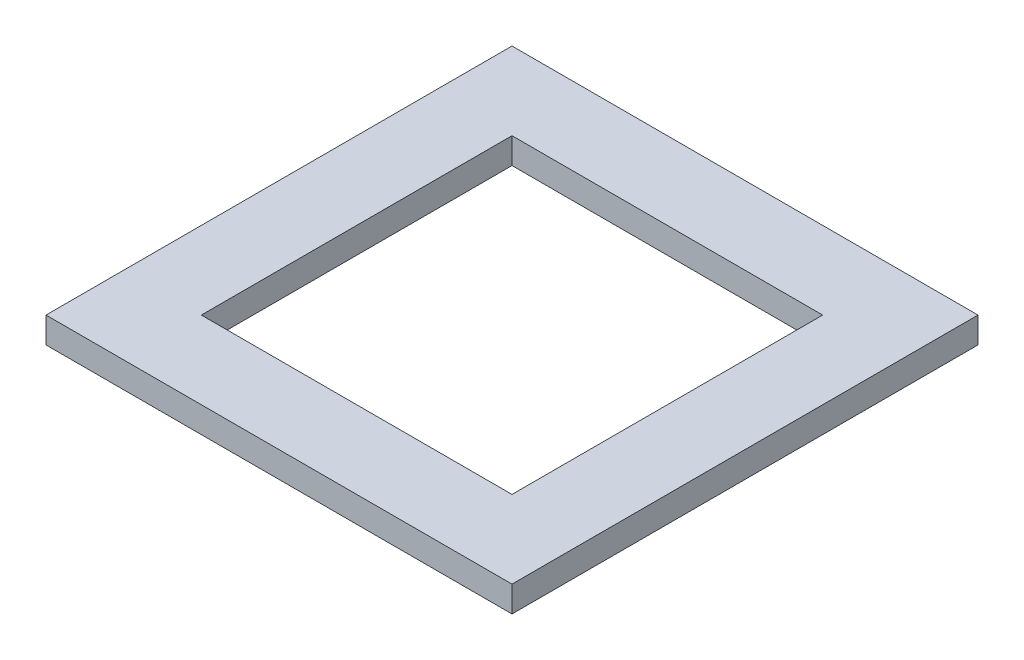
ISO-10303-21;
HEADER;
FILE_DESCRIPTION(('STEP AP214'),'2;1');
FILE_NAME('part.step','',(''),(''),'','','');
FILE_SCHEMA(('AUTOMOTIVE_DESIGN { 1 0 10303 214 1 1 1 1 }'));
ENDSEC;
DATA;
#1=APPLICATION_CONTEXT('core data for automotive mechanical design processes');
#2=APPLICATION_PROTOCOL_DEFINITION('international standard','automotive_design',2000,#1);
#3=PRODUCT_CONTEXT('',#1,'mechanical');
#4=PRODUCT('Part','Part','',(#3));
#5=PRODUCT_RELATED_PRODUCT_CATEGORY('part','',(#4));
#6=PRODUCT_DEFINITION_FORMATION('','',#4);
#7=PRODUCT_DEFINITION_CONTEXT('part definition',#1,'design');
#8=PRODUCT_DEFINITION('design','',#6,#7);
#9=PRODUCT_DEFINITION_SHAPE('','',#8);
#10=(LENGTH_UNIT() NAMED_UNIT(*) SI_UNIT(.MILLI.,.METRE.));
#11=(NAMED_UNIT(*) PLANE_ANGLE_UNIT() SI_UNIT($,.RADIAN.));
#12=(NAMED_UNIT(*) SI_UNIT($,.STERADIAN.) SOLID_ANGLE_UNIT());
#13=UNCERTAINTY_MEASURE_WITH_UNIT(LENGTH_MEASURE(1.E-05),#10,'distance_accuracy_value','');
#14=(GEOMETRIC_REPRESENTATION_CONTEXT(3) GLOBAL_UNCERTAINTY_ASSIGNED_CONTEXT((#13)) GLOBAL_UNIT_ASSIGNED_CONTEXT((#10,
#11,#12)) REPRESENTATION_CONTEXT('',''));
#15=CARTESIAN_POINT('',(0.,0.,0.));
#16=DIRECTION('',(0.,0.,1.));
#17=DIRECTION('',(1.,0.,0.));
#18=AXIS2_PLACEMENT_3D('',#15,#16,#17);
#19=CARTESIAN_POINT('',(0.,5.,0.));
#20=DIRECTION('',(0.,-1.,0.));
#21=DIRECTION('',(0.,0.,-1.));
#22=AXIS2_PLACEMENT_3D('',#19,#20,#21);
#23=PLANE('',#22);
#24=DIRECTION('',(0.,0.,-1.));
#25=VECTOR('',#24,1.);
#26=CARTESIAN_POINT('',(45.,5.,45.0000000000001));
#27=LINE('',#26,#25);
#28=CARTESIAN_POINT('',(45.,5.,45.0000000000001));
#29=VERTEX_POINT('',#28);
#30=CARTESIAN_POINT('',(45.,5.,-44.9999999999999));
#31=VERTEX_POINT('',#30);
#32=EDGE_CURVE('E164',#29,#31,#27,.T.);
#33=ORIENTED_EDGE('',*,*,#32,.T.);
#34=DIRECTION('',(-1.,0.,0.));
#35=VECTOR('',#34,1.);
#36=CARTESIAN_POINT('',(-45.,5.,-44.9999999999999));
#37=LINE('',#36,#35);
#38=CARTESIAN_POINT('',(-45.,5.,-44.9999999999999));
#39=VERTEX_POINT('',#38);
#40=EDGE_CURVE('E166',#31,#39,#37,.T.);
#41=ORIENTED_EDGE('',*,*,#40,.T.);
#42=DIRECTION('',(0.,0.,1.));
#43=VECTOR('',#42,1.);
#44=CARTESIAN_POINT('',(-45.,5.,45.0000000000001));
#45=LINE('',#44,#43);
#46=CARTESIAN_POINT('',(-45.,5.,45.0000000000001));
#47=VERTEX_POINT('',#46);
#48=EDGE_CURVE('E175',#39,#47,#45,.T.);
#49=ORIENTED_EDGE('',*,*,#48,.T.);
#50=DIRECTION('',(1.,0.,0.));
#51=VECTOR('',#50,1.);
#52=CARTESIAN_POINT('',(-45.,5.,45.0000000000001));
#53=LINE('',#52,#51);
#54=EDGE_CURVE('E172',#47,#29,#53,.T.);
#55=ORIENTED_EDGE('',*,*,#54,.T.);
#56=EDGE_LOOP('',(#33,#41,#49,#55));
#57=FACE_BOUND('',#56,.T.);
#58=DIRECTION('',(0.,0.,1.));
#59=VECTOR('',#58,1.);
#60=CARTESIAN_POINT('',(-30.,5.,30.0000000000001));
#61=LINE('',#60,#59);
#62=CARTESIAN_POINT('',(-30.,5.,-29.9999999999999));
#63=VERTEX_POINT('',#62);
#64=CARTESIAN_POINT('',(-30.,5.,30.0000000000001));
#65=VERTEX_POINT('',#64);
#66=EDGE_CURVE('E113',#63,#65,#61,.T.);
#67=ORIENTED_EDGE('',*,*,#66,.F.);
#68=DIRECTION('',(-1.,0.,0.));
#69=VECTOR('',#68,1.);
#70=CARTESIAN_POINT('',(-30.,5.,-29.9999999999999));
#71=LINE('',#70,#69);
#72=CARTESIAN_POINT('',(30.,5.,-29.9999999999999));
#73=VERTEX_POINT('',#72);
#74=EDGE_CURVE('E145',#73,#63,#71,.T.);
#75=ORIENTED_EDGE('',*,*,#74,.F.);
#76=DIRECTION('',(0.,0.,-1.));
#77=VECTOR('',#76,1.);
#78=CARTESIAN_POINT('',(30.,5.,30.0000000000001));
#79=LINE('',#78,#77);
#80=CARTESIAN_POINT('',(30.,5.,30.0000000000001));
#81=VERTEX_POINT('',#80);
#82=EDGE_CURVE('E140',#81,#73,#79,.T.);
#83=ORIENTED_EDGE('',*,*,#82,.F.);
#84=DIRECTION('',(1.,0.,0.));
#85=VECTOR('',#84,1.);
#86=CARTESIAN_POINT('',(-30.,5.,30.0000000000001));
#87=LINE('',#86,#85);
#88=EDGE_CURVE('E125',#65,#81,#87,.T.);
#89=ORIENTED_EDGE('',*,*,#88,.F.);
#90=EDGE_LOOP('',(#67,#75,#83,#89));
#91=FACE_BOUND('',#90,.T.);
#92=ADVANCED_FACE('F47',(#57,#91),#23,.F.);
#93=CARTESIAN_POINT('',(0.,0.,0.));
#94=DIRECTION('',(0.,-1.,0.));
#95=DIRECTION('',(0.,0.,-1.));
#96=AXIS2_PLACEMENT_3D('',#93,#94,#95);
#97=PLANE('',#96);
#98=DIRECTION('',(0.,0.,-1.));
#99=VECTOR('',#98,1.);
#100=CARTESIAN_POINT('',(45.,0.,45.0000000000001));
#101=LINE('',#100,#99);
#102=CARTESIAN_POINT('',(45.,0.,45.0000000000001));
#103=VERTEX_POINT('',#102);
#104=CARTESIAN_POINT('',(45.,0.,-44.9999999999999));
#105=VERTEX_POINT('',#104);
#106=EDGE_CURVE('E133',#103,#105,#101,.T.);
#107=ORIENTED_EDGE('',*,*,#106,.F.);
#108=DIRECTION('',(1.,0.,0.));
#109=VECTOR('',#108,1.);
#110=CARTESIAN_POINT('',(-45.,0.,45.0000000000001));
#111=LINE('',#110,#109);
#112=CARTESIAN_POINT('',(-45.,0.,45.0000000000001));
#113=VERTEX_POINT('',#112);
#114=EDGE_CURVE('E170',#113,#103,#111,.T.);
#115=ORIENTED_EDGE('',*,*,#114,.F.);
#116=DIRECTION('',(0.,0.,1.));
#117=VECTOR('',#116,1.);
#118=CARTESIAN_POINT('',(-45.,0.,45.0000000000001));
#119=LINE('',#118,#117);
#120=CARTESIAN_POINT('',(-45.,0.,-44.9999999999999));
#121=VERTEX_POINT('',#120);
#122=EDGE_CURVE('E184',#121,#113,#119,.T.);
#123=ORIENTED_EDGE('',*,*,#122,.F.);
#124=DIRECTION('',(-1.,0.,0.));
#125=VECTOR('',#124,1.);
#126=CARTESIAN_POINT('',(-45.,0.,-44.9999999999999));
#127=LINE('',#126,#125);
#128=EDGE_CURVE('E185',#105,#121,#127,.T.);
#129=ORIENTED_EDGE('',*,*,#128,.F.);
#130=EDGE_LOOP('',(#107,#115,#123,#129));
#131=FACE_BOUND('',#130,.T.);
#132=DIRECTION('',(-1.,0.,0.));
#133=VECTOR('',#132,1.);
#134=CARTESIAN_POINT('',(-30.,0.,-29.9999999999999));
#135=LINE('',#134,#133);
#136=CARTESIAN_POINT('',(30.,0.,-29.9999999999999));
#137=VERTEX_POINT('',#136);
#138=CARTESIAN_POINT('',(-30.,0.,-29.9999999999999));
#139=VERTEX_POINT('',#138);
#140=EDGE_CURVE('E124',#137,#139,#135,.T.);
#141=ORIENTED_EDGE('',*,*,#140,.T.);
#142=DIRECTION('',(0.,0.,1.));
#143=VECTOR('',#142,1.);
#144=CARTESIAN_POINT('',(-30.,0.,30.0000000000001));
#145=LINE('',#144,#143);
#146=CARTESIAN_POINT('',(-30.,0.,30.0000000000001));
#147=VERTEX_POINT('',#146);
#148=EDGE_CURVE('E73',#139,#147,#145,.T.);
#149=ORIENTED_EDGE('',*,*,#148,.T.);
#150=DIRECTION('',(1.,0.,0.));
#151=VECTOR('',#150,1.);
#152=CARTESIAN_POINT('',(-30.,0.,30.0000000000001));
#153=LINE('',#152,#151);
#154=CARTESIAN_POINT('',(30.,0.,30.0000000000001));
#155=VERTEX_POINT('',#154);
#156=EDGE_CURVE('E131',#147,#155,#153,.T.);
#157=ORIENTED_EDGE('',*,*,#156,.T.);
#158=DIRECTION('',(0.,0.,-1.));
#159=VECTOR('',#158,1.);
#160=CARTESIAN_POINT('',(30.,0.,30.0000000000001));
#161=LINE('',#160,#159);
#162=EDGE_CURVE('E152',#155,#137,#161,.T.);
#163=ORIENTED_EDGE('',*,*,#162,.T.);
#164=EDGE_LOOP('',(#141,#149,#157,#163));
#165=FACE_BOUND('',#164,.T.);
#166=ADVANCED_FACE('F209',(#131,#165),#97,.T.);
#167=CARTESIAN_POINT('',(45.,5.,45.0000000000001));
#168=DIRECTION('',(-1.,0.,0.));
#169=DIRECTION('',(0.,0.,1.));
#170=AXIS2_PLACEMENT_3D('',#167,#168,#169);
#171=PLANE('',#170);
#172=ORIENTED_EDGE('',*,*,#106,.T.);
#173=DIRECTION('',(0.,-1.,0.));
#174=VECTOR('',#173,1.);
#175=CARTESIAN_POINT('',(45.,5.,-44.9999999999999));
#176=LINE('',#175,#174);
#177=EDGE_CURVE('E11',#31,#105,#176,.T.);
#178=ORIENTED_EDGE('',*,*,#177,.F.);
#179=ORIENTED_EDGE('',*,*,#32,.F.);
#180=DIRECTION('',(0.,-1.,0.));
#181=VECTOR('',#180,1.);
#182=CARTESIAN_POINT('',(45.,5.,45.0000000000001));
#183=LINE('',#182,#181);
#184=EDGE_CURVE('E178',#29,#103,#183,.T.);
#185=ORIENTED_EDGE('',*,*,#184,.T.);
#186=EDGE_LOOP('',(#172,#178,#179,#185));
#187=FACE_BOUND('',#186,.T.);
#188=ADVANCED_FACE('F51',(#187),#171,.F.);
#189=CARTESIAN_POINT('',(-45.,5.,-44.9999999999999));
#190=DIRECTION('',(0.,0.,1.));
#191=DIRECTION('',(1.,0.,0.));
#192=AXIS2_PLACEMENT_3D('',#189,#190,#191);
#193=PLANE('',#192);
#194=ORIENTED_EDGE('',*,*,#128,.T.);
#195=DIRECTION('',(0.,-1.,0.));
#196=VECTOR('',#195,1.);
#197=CARTESIAN_POINT('',(-45.,5.,-44.9999999999999));
#198=LINE('',#197,#196);
#199=EDGE_CURVE('E59',#39,#121,#198,.T.);
#200=ORIENTED_EDGE('',*,*,#199,.F.);
#201=ORIENTED_EDGE('',*,*,#40,.F.);
#202=ORIENTED_EDGE('',*,*,#177,.T.);
#203=EDGE_LOOP('',(#194,#200,#201,#202));
#204=FACE_BOUND('',#203,.T.);
#205=ADVANCED_FACE('F219',(#204),#193,.F.);
#206=CARTESIAN_POINT('',(-45.,5.,45.0000000000001));
#207=DIRECTION('',(1.,0.,0.));
#208=DIRECTION('',(0.,0.,-1.));
#209=AXIS2_PLACEMENT_3D('',#206,#207,#208);
#210=PLANE('',#209);
#211=ORIENTED_EDGE('',*,*,#122,.T.);
#212=DIRECTION('',(0.,-1.,0.));
#213=VECTOR('',#212,1.);
#214=CARTESIAN_POINT('',(-45.,5.,45.0000000000001));
#215=LINE('',#214,#213);
#216=EDGE_CURVE('E194',#47,#113,#215,.T.);
#217=ORIENTED_EDGE('',*,*,#216,.F.);
#218=ORIENTED_EDGE('',*,*,#48,.F.);
#219=ORIENTED_EDGE('',*,*,#199,.T.);
#220=EDGE_LOOP('',(#211,#217,#218,#219));
#221=FACE_BOUND('',#220,.T.);
#222=ADVANCED_FACE('F201',(#221),#210,.F.);
#223=CARTESIAN_POINT('',(-45.,5.,45.0000000000001));
#224=DIRECTION('',(0.,0.,-1.));
#225=DIRECTION('',(-1.,0.,0.));
#226=AXIS2_PLACEMENT_3D('',#223,#224,#225);
#227=PLANE('',#226);
#228=ORIENTED_EDGE('',*,*,#114,.T.);
#229=ORIENTED_EDGE('',*,*,#184,.F.);
#230=ORIENTED_EDGE('',*,*,#54,.F.);
#231=ORIENTED_EDGE('',*,*,#216,.T.);
#232=EDGE_LOOP('',(#228,#229,#230,#231));
#233=FACE_BOUND('',#232,.T.);
#234=ADVANCED_FACE('F211',(#233),#227,.F.);
#235=CARTESIAN_POINT('',(-30.,5.,30.0000000000001));
#236=DIRECTION('',(1.,0.,0.));
#237=DIRECTION('',(0.,0.,-1.));
#238=AXIS2_PLACEMENT_3D('',#235,#236,#237);
#239=PLANE('',#238);
#240=ORIENTED_EDGE('',*,*,#148,.F.);
#241=DIRECTION('',(0.,-1.,0.));
#242=VECTOR('',#241,1.);
#243=CARTESIAN_POINT('',(-30.,5.,-29.9999999999999));
#244=LINE('',#243,#242);
#245=EDGE_CURVE('E119',#63,#139,#244,.T.);
#246=ORIENTED_EDGE('',*,*,#245,.F.);
#247=ORIENTED_EDGE('',*,*,#66,.T.);
#248=DIRECTION('',(0.,-1.,0.));
#249=VECTOR('',#248,1.);
#250=CARTESIAN_POINT('',(-30.,5.,30.0000000000001));
#251=LINE('',#250,#249);
#252=EDGE_CURVE('E118',#65,#147,#251,.T.);
#253=ORIENTED_EDGE('',*,*,#252,.T.);
#254=EDGE_LOOP('',(#240,#246,#247,#253));
#255=FACE_BOUND('',#254,.T.);
#256=ADVANCED_FACE('F120',(#255),#239,.T.);
#257=CARTESIAN_POINT('',(-30.,5.,30.0000000000001));
#258=DIRECTION('',(0.,0.,-1.));
#259=DIRECTION('',(-1.,0.,0.));
#260=AXIS2_PLACEMENT_3D('',#257,#258,#259);
#261=PLANE('',#260);
#262=ORIENTED_EDGE('',*,*,#156,.F.);
#263=ORIENTED_EDGE('',*,*,#252,.F.);
#264=ORIENTED_EDGE('',*,*,#88,.T.);
#265=DIRECTION('',(0.,-1.,0.));
#266=VECTOR('',#265,1.);
#267=CARTESIAN_POINT('',(30.,5.,30.0000000000001));
#268=LINE('',#267,#266);
#269=EDGE_CURVE('E132',#81,#155,#268,.T.);
#270=ORIENTED_EDGE('',*,*,#269,.T.);
#271=EDGE_LOOP('',(#262,#263,#264,#270));
#272=FACE_BOUND('',#271,.T.);
#273=ADVANCED_FACE('F126',(#272),#261,.T.);
#274=CARTESIAN_POINT('',(30.,5.,30.0000000000001));
#275=DIRECTION('',(-1.,0.,0.));
#276=DIRECTION('',(0.,0.,1.));
#277=AXIS2_PLACEMENT_3D('',#274,#275,#276);
#278=PLANE('',#277);
#279=ORIENTED_EDGE('',*,*,#162,.F.);
#280=ORIENTED_EDGE('',*,*,#269,.F.);
#281=ORIENTED_EDGE('',*,*,#82,.T.);
#282=DIRECTION('',(0.,-1.,0.));
#283=VECTOR('',#282,1.);
#284=CARTESIAN_POINT('',(30.,5.,-29.9999999999999));
#285=LINE('',#284,#283);
#286=EDGE_CURVE('E61',#73,#137,#285,.T.);
#287=ORIENTED_EDGE('',*,*,#286,.T.);
#288=EDGE_LOOP('',(#279,#280,#281,#287));
#289=FACE_BOUND('',#288,.T.);
#290=ADVANCED_FACE('F239',(#289),#278,.T.);
#291=CARTESIAN_POINT('',(-30.,5.,-29.9999999999999));
#292=DIRECTION('',(0.,0.,1.));
#293=DIRECTION('',(1.,0.,0.));
#294=AXIS2_PLACEMENT_3D('',#291,#292,#293);
#295=PLANE('',#294);
#296=ORIENTED_EDGE('',*,*,#140,.F.);
#297=ORIENTED_EDGE('',*,*,#286,.F.);
#298=ORIENTED_EDGE('',*,*,#74,.T.);
#299=ORIENTED_EDGE('',*,*,#245,.T.);
#300=EDGE_LOOP('',(#296,#297,#298,#299));
#301=FACE_BOUND('',#300,.T.);
#302=ADVANCED_FACE('F242',(#301),#295,.T.);
#303=CLOSED_SHELL('',(#92,#166,#188,#205,#222,#234,#256,#273,#290,#302));
#304=MANIFOLD_SOLID_BREP('B2',#303);
#305=ADVANCED_BREP_SHAPE_REPRESENTATION('',(#18,#304),#14);
#306=SHAPE_DEFINITION_REPRESENTATION(#9,#305);
ENDSEC;
END-ISO-10303-21;
